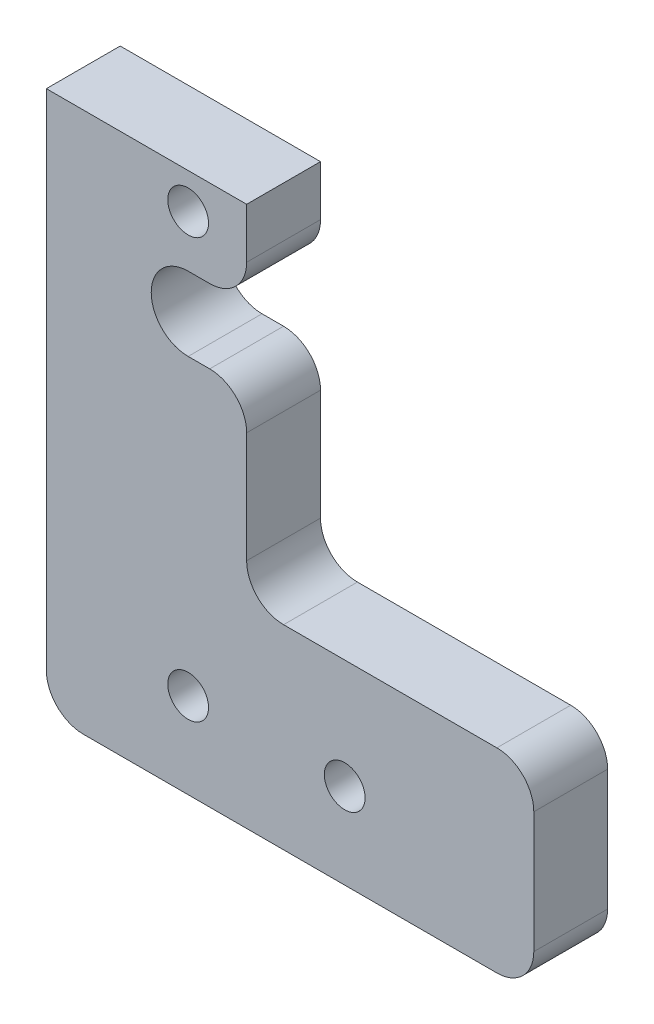
ISO-10303-21;
HEADER;
FILE_DESCRIPTION(('STEP AP214'),'2;1');
FILE_NAME('part.step','',(''),(''),'','','');
FILE_SCHEMA(('AUTOMOTIVE_DESIGN { 1 0 10303 214 1 1 1 1 }'));
ENDSEC;
DATA;
#1=APPLICATION_CONTEXT('core data for automotive mechanical design processes');
#2=APPLICATION_PROTOCOL_DEFINITION('international standard','automotive_design',2000,#1);
#3=PRODUCT_CONTEXT('',#1,'mechanical');
#4=PRODUCT('Part','Part','',(#3));
#5=PRODUCT_RELATED_PRODUCT_CATEGORY('part','',(#4));
#6=PRODUCT_DEFINITION_FORMATION('','',#4);
#7=PRODUCT_DEFINITION_CONTEXT('part definition',#1,'design');
#8=PRODUCT_DEFINITION('design','',#6,#7);
#9=PRODUCT_DEFINITION_SHAPE('','',#8);
#10=(LENGTH_UNIT() NAMED_UNIT(*) SI_UNIT(.MILLI.,.METRE.));
#11=(NAMED_UNIT(*) PLANE_ANGLE_UNIT() SI_UNIT($,.RADIAN.));
#12=(NAMED_UNIT(*) SI_UNIT($,.STERADIAN.) SOLID_ANGLE_UNIT());
#13=UNCERTAINTY_MEASURE_WITH_UNIT(LENGTH_MEASURE(1.E-05),#10,'distance_accuracy_value','');
#14=(GEOMETRIC_REPRESENTATION_CONTEXT(3) GLOBAL_UNCERTAINTY_ASSIGNED_CONTEXT((#13)) GLOBAL_UNIT_ASSIGNED_CONTEXT((#10,
#11,#12)) REPRESENTATION_CONTEXT('',''));
#15=CARTESIAN_POINT('',(0.,0.,0.));
#16=DIRECTION('',(0.,0.,1.));
#17=DIRECTION('',(1.,0.,0.));
#18=AXIS2_PLACEMENT_3D('',#15,#16,#17);
#19=CARTESIAN_POINT('',(0.,3.17500000000002,3.175));
#20=DIRECTION('',(-1.,0.,0.));
#21=DIRECTION('',(0.,-1.,0.));
#22=AXIS2_PLACEMENT_3D('',#19,#20,#21);
#23=PLANE('',#22);
#24=DIRECTION('',(0.,1.,0.));
#25=VECTOR('',#24,1.);
#26=CARTESIAN_POINT('',(0.,3.17500000000002,3.175));
#27=LINE('',#26,#25);
#28=CARTESIAN_POINT('',(0.,25.4,3.175));
#29=VERTEX_POINT('',#28);
#30=CARTESIAN_POINT('',(0.,29.718,3.175));
#31=VERTEX_POINT('',#30);
#32=EDGE_CURVE('E268',#29,#31,#27,.T.);
#33=ORIENTED_EDGE('',*,*,#32,.F.);
#34=DIRECTION('',(0.,0.,-1.));
#35=VECTOR('',#34,1.);
#36=CARTESIAN_POINT('',(0.,25.4,3.175));
#37=LINE('',#36,#35);
#38=CARTESIAN_POINT('',(0.,25.4,-3.175));
#39=VERTEX_POINT('',#38);
#40=EDGE_CURVE('E341',#29,#39,#37,.T.);
#41=ORIENTED_EDGE('',*,*,#40,.T.);
#42=DIRECTION('',(0.,1.,0.));
#43=VECTOR('',#42,1.);
#44=CARTESIAN_POINT('',(0.,3.17500000000002,-3.175));
#45=LINE('',#44,#43);
#46=CARTESIAN_POINT('',(0.,29.718,-3.175));
#47=VERTEX_POINT('',#46);
#48=EDGE_CURVE('E300',#39,#47,#45,.T.);
#49=ORIENTED_EDGE('',*,*,#48,.T.);
#50=DIRECTION('',(0.,0.,-1.));
#51=VECTOR('',#50,1.);
#52=CARTESIAN_POINT('',(0.,29.718,3.175));
#53=LINE('',#52,#51);
#54=EDGE_CURVE('E272',#31,#47,#53,.T.);
#55=ORIENTED_EDGE('',*,*,#54,.F.);
#56=EDGE_LOOP('',(#33,#41,#49,#55));
#57=FACE_BOUND('',#56,.T.);
#58=ADVANCED_FACE('F40',(#57),#23,.F.);
#59=CARTESIAN_POINT('',(-14.0462,-13.589,3.175));
#60=DIRECTION('',(0.,0.,-1.));
#61=DIRECTION('',(-1.,0.,0.));
#62=AXIS2_PLACEMENT_3D('',#59,#60,#61);
#63=PLANE('',#62);
#64=DIRECTION('',(-1.,0.,0.));
#65=VECTOR('',#64,1.);
#66=CARTESIAN_POINT('',(-5.0292,22.225,3.175));
#67=LINE('',#66,#65);
#68=CARTESIAN_POINT('',(-3.175,22.225,3.175));
#69=VERTEX_POINT('',#68);
#70=CARTESIAN_POINT('',(-5.0292,22.225,3.175));
#71=VERTEX_POINT('',#70);
#72=EDGE_CURVE('E204',#69,#71,#67,.T.);
#73=ORIENTED_EDGE('',*,*,#72,.F.);
#74=CARTESIAN_POINT('',(-3.175,25.4,3.175));
#75=DIRECTION('',(0.,0.,-1.));
#76=DIRECTION('',(-1.,0.,0.));
#77=AXIS2_PLACEMENT_3D('',#74,#75,#76);
#78=CIRCLE('',#77,3.175);
#79=EDGE_CURVE('E355',#69,#29,#78,.F.);
#80=ORIENTED_EDGE('',*,*,#79,.T.);
#81=ORIENTED_EDGE('',*,*,#32,.T.);
#82=DIRECTION('',(-1.,0.,0.));
#83=VECTOR('',#82,1.);
#84=CARTESIAN_POINT('',(0.,29.718,3.175));
#85=LINE('',#84,#83);
#86=CARTESIAN_POINT('',(-17.2212,29.718,3.175));
#87=VERTEX_POINT('',#86);
#88=EDGE_CURVE('E241',#31,#87,#85,.T.);
#89=ORIENTED_EDGE('',*,*,#88,.T.);
#90=DIRECTION('',(0.,-1.,0.));
#91=VECTOR('',#90,1.);
#92=CARTESIAN_POINT('',(-17.2212,29.718,3.175));
#93=LINE('',#92,#91);
#94=CARTESIAN_POINT('',(-17.2212,-13.589,3.175));
#95=VERTEX_POINT('',#94);
#96=EDGE_CURVE('E245',#87,#95,#93,.T.);
#97=ORIENTED_EDGE('',*,*,#96,.T.);
#98=CARTESIAN_POINT('',(-14.0462,-13.589,3.175));
#99=DIRECTION('',(0.,0.,1.));
#100=DIRECTION('',(-1.,0.,0.));
#101=AXIS2_PLACEMENT_3D('',#98,#99,#100);
#102=CIRCLE('',#101,3.175);
#103=CARTESIAN_POINT('',(-14.0462,-16.764,3.175));
#104=VERTEX_POINT('',#103);
#105=EDGE_CURVE('E248',#95,#104,#102,.T.);
#106=ORIENTED_EDGE('',*,*,#105,.T.);
#107=DIRECTION('',(1.,0.,0.));
#108=VECTOR('',#107,1.);
#109=CARTESIAN_POINT('',(-14.0462,-16.764,3.175));
#110=LINE('',#109,#108);
#111=CARTESIAN_POINT('',(21.5138,-16.764,3.175));
#112=VERTEX_POINT('',#111);
#113=EDGE_CURVE('E251',#104,#112,#110,.T.);
#114=ORIENTED_EDGE('',*,*,#113,.T.);
#115=CARTESIAN_POINT('',(21.5138,-13.589,3.175));
#116=DIRECTION('',(0.,0.,1.));
#117=DIRECTION('',(-1.,0.,0.));
#118=AXIS2_PLACEMENT_3D('',#115,#116,#117);
#119=CIRCLE('',#118,3.175);
#120=CARTESIAN_POINT('',(24.6888,-13.589,3.175));
#121=VERTEX_POINT('',#120);
#122=EDGE_CURVE('E254',#112,#121,#119,.T.);
#123=ORIENTED_EDGE('',*,*,#122,.T.);
#124=DIRECTION('',(0.,1.,0.));
#125=VECTOR('',#124,1.);
#126=CARTESIAN_POINT('',(24.6888,-13.589,3.175));
#127=LINE('',#126,#125);
#128=CARTESIAN_POINT('',(24.6888,-3.175,3.175));
#129=VERTEX_POINT('',#128);
#130=EDGE_CURVE('E257',#121,#129,#127,.T.);
#131=ORIENTED_EDGE('',*,*,#130,.T.);
#132=CARTESIAN_POINT('',(21.5138,-3.175,3.175));
#133=DIRECTION('',(0.,0.,1.));
#134=DIRECTION('',(1.,0.,0.));
#135=AXIS2_PLACEMENT_3D('',#132,#133,#134);
#136=CIRCLE('',#135,3.175);
#137=CARTESIAN_POINT('',(21.5138,0.,3.175));
#138=VERTEX_POINT('',#137);
#139=EDGE_CURVE('E259',#129,#138,#136,.T.);
#140=ORIENTED_EDGE('',*,*,#139,.T.);
#141=DIRECTION('',(-1.,0.,0.));
#142=VECTOR('',#141,1.);
#143=CARTESIAN_POINT('',(21.5138,0.,3.175));
#144=LINE('',#143,#142);
#145=CARTESIAN_POINT('',(3.17500000000002,0.,3.175));
#146=VERTEX_POINT('',#145);
#147=EDGE_CURVE('E262',#138,#146,#144,.T.);
#148=ORIENTED_EDGE('',*,*,#147,.T.);
#149=CARTESIAN_POINT('',(3.175,3.175,3.175));
#150=DIRECTION('',(0.,0.,-1.));
#151=DIRECTION('',(1.,0.,0.));
#152=AXIS2_PLACEMENT_3D('',#149,#150,#151);
#153=CIRCLE('',#152,3.175);
#154=CARTESIAN_POINT('',(0.,3.17500000000002,3.175));
#155=VERTEX_POINT('',#154);
#156=EDGE_CURVE('E265',#146,#155,#153,.T.);
#157=ORIENTED_EDGE('',*,*,#156,.T.);
#158=CARTESIAN_POINT('',(0.,12.7,3.175));
#159=VERTEX_POINT('',#158);
#160=EDGE_CURVE('E269',#155,#159,#27,.T.);
#161=ORIENTED_EDGE('',*,*,#160,.T.);
#162=CARTESIAN_POINT('',(-3.175,12.7,3.175));
#163=DIRECTION('',(0.,0.,-1.));
#164=DIRECTION('',(-1.,0.,0.));
#165=AXIS2_PLACEMENT_3D('',#162,#163,#164);
#166=CIRCLE('',#165,3.175);
#167=CARTESIAN_POINT('',(-3.175,15.875,3.175));
#168=VERTEX_POINT('',#167);
#169=EDGE_CURVE('E59',#159,#168,#166,.F.);
#170=ORIENTED_EDGE('',*,*,#169,.T.);
#171=DIRECTION('',(1.,0.,0.));
#172=VECTOR('',#171,1.);
#173=CARTESIAN_POINT('',(24.6888,15.875,3.175));
#174=LINE('',#173,#172);
#175=CARTESIAN_POINT('',(-5.0292,15.875,3.175));
#176=VERTEX_POINT('',#175);
#177=EDGE_CURVE('E208',#176,#168,#174,.T.);
#178=ORIENTED_EDGE('',*,*,#177,.F.);
#179=CARTESIAN_POINT('',(-5.0292,19.05,3.175));
#180=DIRECTION('',(0.,0.,1.));
#181=DIRECTION('',(-1.,0.,0.));
#182=AXIS2_PLACEMENT_3D('',#179,#180,#181);
#183=CIRCLE('',#182,3.175);
#184=EDGE_CURVE('E185',#71,#176,#183,.T.);
#185=ORIENTED_EDGE('',*,*,#184,.F.);
#186=EDGE_LOOP('',(#73,#80,#81,#89,#97,#106,#114,#123,#131,#140,#148,#157,#161,#170,#178,#185));
#187=FACE_BOUND('',#186,.T.);
#188=CARTESIAN_POINT('',(-5.0292,26.67,3.175));
#189=DIRECTION('',(0.,0.,1.));
#190=DIRECTION('',(1.,0.,0.));
#191=AXIS2_PLACEMENT_3D('',#188,#189,#190);
#192=CIRCLE('',#191,1.7526);
#193=CARTESIAN_POINT('',(-3.2766,26.67,3.175));
#194=VERTEX_POINT('',#193);
#195=EDGE_CURVE('E233',#194,#194,#192,.T.);
#196=ORIENTED_EDGE('',*,*,#195,.F.);
#197=EDGE_LOOP('',(#196));
#198=FACE_BOUND('',#197,.T.);
#199=CARTESIAN_POINT('',(-5.02920000000001,-9.39799999999999,3.175));
#200=DIRECTION('',(0.,0.,1.));
#201=DIRECTION('',(1.,0.,0.));
#202=AXIS2_PLACEMENT_3D('',#199,#200,#201);
#203=CIRCLE('',#202,1.7526);
#204=CARTESIAN_POINT('',(-3.27660000000001,-9.39799999999999,3.175));
#205=VERTEX_POINT('',#204);
#206=EDGE_CURVE('E225',#205,#205,#203,.T.);
#207=ORIENTED_EDGE('',*,*,#206,.F.);
#208=EDGE_LOOP('',(#207));
#209=FACE_BOUND('',#208,.T.);
#210=CARTESIAN_POINT('',(8.43279999999999,-9.39799999999999,3.175));
#211=DIRECTION('',(0.,0.,1.));
#212=DIRECTION('',(1.,0.,0.));
#213=AXIS2_PLACEMENT_3D('',#210,#211,#212);
#214=CIRCLE('',#213,1.7526);
#215=CARTESIAN_POINT('',(10.1854,-9.39799999999999,3.175));
#216=VERTEX_POINT('',#215);
#217=EDGE_CURVE('E217',#216,#216,#214,.T.);
#218=ORIENTED_EDGE('',*,*,#217,.F.);
#219=EDGE_LOOP('',(#218));
#220=FACE_BOUND('',#219,.T.);
#221=ADVANCED_FACE('F363',(#187,#198,#209,#220),#63,.F.);
#222=CARTESIAN_POINT('',(-14.0462,-13.589,-3.175));
#223=DIRECTION('',(0.,0.,-1.));
#224=DIRECTION('',(-1.,0.,0.));
#225=AXIS2_PLACEMENT_3D('',#222,#223,#224);
#226=PLANE('',#225);
#227=ORIENTED_EDGE('',*,*,#48,.F.);
#228=CARTESIAN_POINT('',(-3.175,25.4,-3.175));
#229=DIRECTION('',(0.,0.,-1.));
#230=DIRECTION('',(-1.,0.,0.));
#231=AXIS2_PLACEMENT_3D('',#228,#229,#230);
#232=CIRCLE('',#231,3.175);
#233=CARTESIAN_POINT('',(-3.175,22.225,-3.175));
#234=VERTEX_POINT('',#233);
#235=EDGE_CURVE('E348',#39,#234,#232,.T.);
#236=ORIENTED_EDGE('',*,*,#235,.T.);
#237=DIRECTION('',(-1.,0.,0.));
#238=VECTOR('',#237,1.);
#239=CARTESIAN_POINT('',(-5.0292,22.225,-3.175));
#240=LINE('',#239,#238);
#241=CARTESIAN_POINT('',(-5.0292,22.225,-3.175));
#242=VERTEX_POINT('',#241);
#243=EDGE_CURVE('E189',#234,#242,#240,.T.);
#244=ORIENTED_EDGE('',*,*,#243,.T.);
#245=CARTESIAN_POINT('',(-5.0292,19.05,-3.175));
#246=DIRECTION('',(0.,0.,1.));
#247=DIRECTION('',(-1.,0.,0.));
#248=AXIS2_PLACEMENT_3D('',#245,#246,#247);
#249=CIRCLE('',#248,3.175);
#250=CARTESIAN_POINT('',(-5.0292,15.875,-3.175));
#251=VERTEX_POINT('',#250);
#252=EDGE_CURVE('E183',#242,#251,#249,.T.);
#253=ORIENTED_EDGE('',*,*,#252,.T.);
#254=DIRECTION('',(1.,0.,0.));
#255=VECTOR('',#254,1.);
#256=CARTESIAN_POINT('',(24.6888,15.875,-3.175));
#257=LINE('',#256,#255);
#258=CARTESIAN_POINT('',(-3.175,15.875,-3.175));
#259=VERTEX_POINT('',#258);
#260=EDGE_CURVE('E192',#251,#259,#257,.T.);
#261=ORIENTED_EDGE('',*,*,#260,.T.);
#262=CARTESIAN_POINT('',(-3.175,12.7,-3.175));
#263=DIRECTION('',(0.,0.,-1.));
#264=DIRECTION('',(-1.,0.,0.));
#265=AXIS2_PLACEMENT_3D('',#262,#263,#264);
#266=CIRCLE('',#265,3.175);
#267=CARTESIAN_POINT('',(0.,12.7,-3.175));
#268=VERTEX_POINT('',#267);
#269=EDGE_CURVE('E345',#259,#268,#266,.T.);
#270=ORIENTED_EDGE('',*,*,#269,.T.);
#271=CARTESIAN_POINT('',(0.,3.17500000000002,-3.175));
#272=VERTEX_POINT('',#271);
#273=EDGE_CURVE('E246',#272,#268,#45,.T.);
#274=ORIENTED_EDGE('',*,*,#273,.F.);
#275=CARTESIAN_POINT('',(3.175,3.175,-3.175));
#276=DIRECTION('',(0.,0.,-1.));
#277=DIRECTION('',(1.,0.,0.));
#278=AXIS2_PLACEMENT_3D('',#275,#276,#277);
#279=CIRCLE('',#278,3.175);
#280=CARTESIAN_POINT('',(3.17500000000002,0.,-3.175));
#281=VERTEX_POINT('',#280);
#282=EDGE_CURVE('E297',#281,#272,#279,.T.);
#283=ORIENTED_EDGE('',*,*,#282,.F.);
#284=DIRECTION('',(-1.,0.,0.));
#285=VECTOR('',#284,1.);
#286=CARTESIAN_POINT('',(21.5138,0.,-3.175));
#287=LINE('',#286,#285);
#288=CARTESIAN_POINT('',(21.5138,0.,-3.175));
#289=VERTEX_POINT('',#288);
#290=EDGE_CURVE('E294',#289,#281,#287,.T.);
#291=ORIENTED_EDGE('',*,*,#290,.F.);
#292=CARTESIAN_POINT('',(21.5138,-3.175,-3.175));
#293=DIRECTION('',(0.,0.,1.));
#294=DIRECTION('',(1.,0.,0.));
#295=AXIS2_PLACEMENT_3D('',#292,#293,#294);
#296=CIRCLE('',#295,3.175);
#297=CARTESIAN_POINT('',(24.6888,-3.175,-3.175));
#298=VERTEX_POINT('',#297);
#299=EDGE_CURVE('E291',#298,#289,#296,.T.);
#300=ORIENTED_EDGE('',*,*,#299,.F.);
#301=DIRECTION('',(0.,1.,0.));
#302=VECTOR('',#301,1.);
#303=CARTESIAN_POINT('',(24.6888,-13.589,-3.175));
#304=LINE('',#303,#302);
#305=CARTESIAN_POINT('',(24.6888,-13.589,-3.175));
#306=VERTEX_POINT('',#305);
#307=EDGE_CURVE('E288',#306,#298,#304,.T.);
#308=ORIENTED_EDGE('',*,*,#307,.F.);
#309=CARTESIAN_POINT('',(21.5138,-13.589,-3.175));
#310=DIRECTION('',(0.,0.,1.));
#311=DIRECTION('',(-1.,0.,0.));
#312=AXIS2_PLACEMENT_3D('',#309,#310,#311);
#313=CIRCLE('',#312,3.175);
#314=CARTESIAN_POINT('',(21.5138,-16.764,-3.175));
#315=VERTEX_POINT('',#314);
#316=EDGE_CURVE('E285',#315,#306,#313,.T.);
#317=ORIENTED_EDGE('',*,*,#316,.F.);
#318=DIRECTION('',(1.,0.,0.));
#319=VECTOR('',#318,1.);
#320=CARTESIAN_POINT('',(-14.0462,-16.764,-3.175));
#321=LINE('',#320,#319);
#322=CARTESIAN_POINT('',(-14.0462,-16.764,-3.175));
#323=VERTEX_POINT('',#322);
#324=EDGE_CURVE('E282',#323,#315,#321,.T.);
#325=ORIENTED_EDGE('',*,*,#324,.F.);
#326=CARTESIAN_POINT('',(-14.0462,-13.589,-3.175));
#327=DIRECTION('',(0.,0.,1.));
#328=DIRECTION('',(-1.,0.,0.));
#329=AXIS2_PLACEMENT_3D('',#326,#327,#328);
#330=CIRCLE('',#329,3.175);
#331=CARTESIAN_POINT('',(-17.2212,-13.589,-3.175));
#332=VERTEX_POINT('',#331);
#333=EDGE_CURVE('E279',#332,#323,#330,.T.);
#334=ORIENTED_EDGE('',*,*,#333,.F.);
#335=DIRECTION('',(0.,-1.,0.));
#336=VECTOR('',#335,1.);
#337=CARTESIAN_POINT('',(-17.2212,29.718,-3.175));
#338=LINE('',#337,#336);
#339=CARTESIAN_POINT('',(-17.2212,29.718,-3.175));
#340=VERTEX_POINT('',#339);
#341=EDGE_CURVE('E276',#340,#332,#338,.T.);
#342=ORIENTED_EDGE('',*,*,#341,.F.);
#343=DIRECTION('',(-1.,0.,0.));
#344=VECTOR('',#343,1.);
#345=CARTESIAN_POINT('',(0.,29.718,-3.175));
#346=LINE('',#345,#344);
#347=EDGE_CURVE('E237',#47,#340,#346,.T.);
#348=ORIENTED_EDGE('',*,*,#347,.F.);
#349=EDGE_LOOP('',(#227,#236,#244,#253,#261,#270,#274,#283,#291,#300,#308,#317,#325,#334,#342,#348));
#350=FACE_BOUND('',#349,.T.);
#351=CARTESIAN_POINT('',(-5.02920000000001,-9.39799999999999,-3.175));
#352=DIRECTION('',(0.,0.,1.));
#353=DIRECTION('',(1.,0.,0.));
#354=AXIS2_PLACEMENT_3D('',#351,#352,#353);
#355=CIRCLE('',#354,1.7526);
#356=CARTESIAN_POINT('',(-3.27660000000001,-9.39799999999999,-3.175));
#357=VERTEX_POINT('',#356);
#358=EDGE_CURVE('E221',#357,#357,#355,.T.);
#359=ORIENTED_EDGE('',*,*,#358,.T.);
#360=EDGE_LOOP('',(#359));
#361=FACE_BOUND('',#360,.T.);
#362=CARTESIAN_POINT('',(-5.0292,26.67,-3.175));
#363=DIRECTION('',(0.,0.,1.));
#364=DIRECTION('',(1.,0.,0.));
#365=AXIS2_PLACEMENT_3D('',#362,#363,#364);
#366=CIRCLE('',#365,1.7526);
#367=CARTESIAN_POINT('',(-3.2766,26.67,-3.175));
#368=VERTEX_POINT('',#367);
#369=EDGE_CURVE('E229',#368,#368,#366,.T.);
#370=ORIENTED_EDGE('',*,*,#369,.T.);
#371=EDGE_LOOP('',(#370));
#372=FACE_BOUND('',#371,.T.);
#373=CARTESIAN_POINT('',(8.43279999999999,-9.39799999999999,-3.175));
#374=DIRECTION('',(0.,0.,1.));
#375=DIRECTION('',(1.,0.,0.));
#376=AXIS2_PLACEMENT_3D('',#373,#374,#375);
#377=CIRCLE('',#376,1.7526);
#378=CARTESIAN_POINT('',(10.1854,-9.39799999999999,-3.175));
#379=VERTEX_POINT('',#378);
#380=EDGE_CURVE('E215',#379,#379,#377,.T.);
#381=ORIENTED_EDGE('',*,*,#380,.T.);
#382=EDGE_LOOP('',(#381));
#383=FACE_BOUND('',#382,.T.);
#384=ADVANCED_FACE('F199',(#350,#361,#372,#383),#226,.T.);
#385=CARTESIAN_POINT('',(0.,29.718,3.175));
#386=DIRECTION('',(0.,-1.,0.));
#387=DIRECTION('',(1.,0.,0.));
#388=AXIS2_PLACEMENT_3D('',#385,#386,#387);
#389=PLANE('',#388);
#390=ORIENTED_EDGE('',*,*,#347,.T.);
#391=DIRECTION('',(0.,0.,-1.));
#392=VECTOR('',#391,1.);
#393=CARTESIAN_POINT('',(-17.2212,29.718,3.175));
#394=LINE('',#393,#392);
#395=EDGE_CURVE('E338',#87,#340,#394,.T.);
#396=ORIENTED_EDGE('',*,*,#395,.F.);
#397=ORIENTED_EDGE('',*,*,#88,.F.);
#398=ORIENTED_EDGE('',*,*,#54,.T.);
#399=EDGE_LOOP('',(#390,#396,#397,#398));
#400=FACE_BOUND('',#399,.T.);
#401=ADVANCED_FACE('F428',(#400),#389,.F.);
#402=CARTESIAN_POINT('',(-17.2212,29.718,3.175));
#403=DIRECTION('',(1.,0.,0.));
#404=DIRECTION('',(0.,1.,0.));
#405=AXIS2_PLACEMENT_3D('',#402,#403,#404);
#406=PLANE('',#405);
#407=ORIENTED_EDGE('',*,*,#341,.T.);
#408=DIRECTION('',(0.,0.,-1.));
#409=VECTOR('',#408,1.);
#410=CARTESIAN_POINT('',(-17.2212,-13.589,3.175));
#411=LINE('',#410,#409);
#412=EDGE_CURVE('E334',#95,#332,#411,.T.);
#413=ORIENTED_EDGE('',*,*,#412,.F.);
#414=ORIENTED_EDGE('',*,*,#96,.F.);
#415=ORIENTED_EDGE('',*,*,#395,.T.);
#416=EDGE_LOOP('',(#407,#413,#414,#415));
#417=FACE_BOUND('',#416,.T.);
#418=ADVANCED_FACE('F424',(#417),#406,.F.);
#419=CARTESIAN_POINT('',(-14.0462,-13.589,3.175));
#420=DIRECTION('',(0.,0.,-1.));
#421=DIRECTION('',(-1.,0.,0.));
#422=AXIS2_PLACEMENT_3D('',#419,#420,#421);
#423=CYLINDRICAL_SURFACE('',#422,3.175);
#424=ORIENTED_EDGE('',*,*,#333,.T.);
#425=DIRECTION('',(0.,0.,-1.));
#426=VECTOR('',#425,1.);
#427=CARTESIAN_POINT('',(-14.0462,-16.764,3.175));
#428=LINE('',#427,#426);
#429=EDGE_CURVE('E330',#104,#323,#428,.T.);
#430=ORIENTED_EDGE('',*,*,#429,.F.);
#431=ORIENTED_EDGE('',*,*,#105,.F.);
#432=ORIENTED_EDGE('',*,*,#412,.T.);
#433=EDGE_LOOP('',(#424,#430,#431,#432));
#434=FACE_BOUND('',#433,.T.);
#435=ADVANCED_FACE('F420',(#434),#423,.T.);
#436=CARTESIAN_POINT('',(-14.0462,-16.764,3.175));
#437=DIRECTION('',(0.,1.,0.));
#438=DIRECTION('',(0.,0.,1.));
#439=AXIS2_PLACEMENT_3D('',#436,#437,#438);
#440=PLANE('',#439);
#441=ORIENTED_EDGE('',*,*,#324,.T.);
#442=DIRECTION('',(0.,0.,-1.));
#443=VECTOR('',#442,1.);
#444=CARTESIAN_POINT('',(21.5138,-16.764,3.175));
#445=LINE('',#444,#443);
#446=EDGE_CURVE('E326',#112,#315,#445,.T.);
#447=ORIENTED_EDGE('',*,*,#446,.F.);
#448=ORIENTED_EDGE('',*,*,#113,.F.);
#449=ORIENTED_EDGE('',*,*,#429,.T.);
#450=EDGE_LOOP('',(#441,#447,#448,#449));
#451=FACE_BOUND('',#450,.T.);
#452=ADVANCED_FACE('F416',(#451),#440,.F.);
#453=CARTESIAN_POINT('',(21.5138,-13.589,3.175));
#454=DIRECTION('',(0.,0.,-1.));
#455=DIRECTION('',(-1.,0.,0.));
#456=AXIS2_PLACEMENT_3D('',#453,#454,#455);
#457=CYLINDRICAL_SURFACE('',#456,3.175);
#458=ORIENTED_EDGE('',*,*,#316,.T.);
#459=DIRECTION('',(0.,0.,-1.));
#460=VECTOR('',#459,1.);
#461=CARTESIAN_POINT('',(24.6888,-13.589,3.175));
#462=LINE('',#461,#460);
#463=EDGE_CURVE('E323',#121,#306,#462,.T.);
#464=ORIENTED_EDGE('',*,*,#463,.F.);
#465=ORIENTED_EDGE('',*,*,#122,.F.);
#466=ORIENTED_EDGE('',*,*,#446,.T.);
#467=EDGE_LOOP('',(#458,#464,#465,#466));
#468=FACE_BOUND('',#467,.T.);
#469=ADVANCED_FACE('F412',(#468),#457,.T.);
#470=CARTESIAN_POINT('',(24.6888,-13.589,3.175));
#471=DIRECTION('',(-1.,0.,0.));
#472=DIRECTION('',(0.,-1.,0.));
#473=AXIS2_PLACEMENT_3D('',#470,#471,#472);
#474=PLANE('',#473);
#475=ORIENTED_EDGE('',*,*,#307,.T.);
#476=DIRECTION('',(0.,0.,-1.));
#477=VECTOR('',#476,1.);
#478=CARTESIAN_POINT('',(24.6888,-3.175,3.175));
#479=LINE('',#478,#477);
#480=EDGE_CURVE('E319',#129,#298,#479,.T.);
#481=ORIENTED_EDGE('',*,*,#480,.F.);
#482=ORIENTED_EDGE('',*,*,#130,.F.);
#483=ORIENTED_EDGE('',*,*,#463,.T.);
#484=EDGE_LOOP('',(#475,#481,#482,#483));
#485=FACE_BOUND('',#484,.T.);
#486=ADVANCED_FACE('F408',(#485),#474,.F.);
#487=CARTESIAN_POINT('',(21.5138,-3.175,3.175));
#488=DIRECTION('',(0.,0.,-1.));
#489=DIRECTION('',(-1.,0.,0.));
#490=AXIS2_PLACEMENT_3D('',#487,#488,#489);
#491=CYLINDRICAL_SURFACE('',#490,3.175);
#492=ORIENTED_EDGE('',*,*,#299,.T.);
#493=DIRECTION('',(0.,0.,-1.));
#494=VECTOR('',#493,1.);
#495=CARTESIAN_POINT('',(21.5138,0.,3.175));
#496=LINE('',#495,#494);
#497=EDGE_CURVE('E315',#138,#289,#496,.T.);
#498=ORIENTED_EDGE('',*,*,#497,.F.);
#499=ORIENTED_EDGE('',*,*,#139,.F.);
#500=ORIENTED_EDGE('',*,*,#480,.T.);
#501=EDGE_LOOP('',(#492,#498,#499,#500));
#502=FACE_BOUND('',#501,.T.);
#503=ADVANCED_FACE('F402',(#502),#491,.T.);
#504=CARTESIAN_POINT('',(21.5138,0.,3.175));
#505=DIRECTION('',(0.,-1.,0.));
#506=DIRECTION('',(1.,0.,0.));
#507=AXIS2_PLACEMENT_3D('',#504,#505,#506);
#508=PLANE('',#507);
#509=ORIENTED_EDGE('',*,*,#290,.T.);
#510=DIRECTION('',(0.,0.,-1.));
#511=VECTOR('',#510,1.);
#512=CARTESIAN_POINT('',(3.17500000000002,0.,3.175));
#513=LINE('',#512,#511);
#514=EDGE_CURVE('E311',#146,#281,#513,.T.);
#515=ORIENTED_EDGE('',*,*,#514,.F.);
#516=ORIENTED_EDGE('',*,*,#147,.F.);
#517=ORIENTED_EDGE('',*,*,#497,.T.);
#518=EDGE_LOOP('',(#509,#515,#516,#517));
#519=FACE_BOUND('',#518,.T.);
#520=ADVANCED_FACE('F398',(#519),#508,.F.);
#521=CARTESIAN_POINT('',(3.175,3.175,3.175));
#522=DIRECTION('',(0.,0.,-1.));
#523=DIRECTION('',(-1.,0.,0.));
#524=AXIS2_PLACEMENT_3D('',#521,#522,#523);
#525=CYLINDRICAL_SURFACE('',#524,3.175);
#526=ORIENTED_EDGE('',*,*,#282,.T.);
#527=DIRECTION('',(0.,0.,-1.));
#528=VECTOR('',#527,1.);
#529=CARTESIAN_POINT('',(0.,3.17500000000002,3.175));
#530=LINE('',#529,#528);
#531=EDGE_CURVE('E307',#155,#272,#530,.T.);
#532=ORIENTED_EDGE('',*,*,#531,.F.);
#533=ORIENTED_EDGE('',*,*,#156,.F.);
#534=ORIENTED_EDGE('',*,*,#514,.T.);
#535=EDGE_LOOP('',(#526,#532,#533,#534));
#536=FACE_BOUND('',#535,.T.);
#537=ADVANCED_FACE('F370',(#536),#525,.F.);
#538=ORIENTED_EDGE('',*,*,#273,.T.);
#539=DIRECTION('',(0.,0.,1.));
#540=VECTOR('',#539,1.);
#541=CARTESIAN_POINT('',(0.,12.7,3.175));
#542=LINE('',#541,#540);
#543=EDGE_CURVE('E49',#268,#159,#542,.T.);
#544=ORIENTED_EDGE('',*,*,#543,.T.);
#545=ORIENTED_EDGE('',*,*,#160,.F.);
#546=ORIENTED_EDGE('',*,*,#531,.T.);
#547=EDGE_LOOP('',(#538,#544,#545,#546));
#548=FACE_BOUND('',#547,.T.);
#549=ADVANCED_FACE('F360',(#548),#23,.F.);
#550=CARTESIAN_POINT('',(-5.0292,26.67,3.175));
#551=DIRECTION('',(0.,0.,-1.));
#552=DIRECTION('',(-1.,0.,0.));
#553=AXIS2_PLACEMENT_3D('',#550,#551,#552);
#554=CYLINDRICAL_SURFACE('',#553,1.7526);
#555=ORIENTED_EDGE('',*,*,#195,.T.);
#556=EDGE_LOOP('',(#555));
#557=FACE_BOUND('',#556,.T.);
#558=ORIENTED_EDGE('',*,*,#369,.F.);
#559=EDGE_LOOP('',(#558));
#560=FACE_BOUND('',#559,.T.);
#561=ADVANCED_FACE('F390',(#557,#560),#554,.F.);
#562=CARTESIAN_POINT('',(-5.02920000000001,-9.39799999999999,3.175));
#563=DIRECTION('',(0.,0.,-1.));
#564=DIRECTION('',(-1.,0.,0.));
#565=AXIS2_PLACEMENT_3D('',#562,#563,#564);
#566=CYLINDRICAL_SURFACE('',#565,1.7526);
#567=ORIENTED_EDGE('',*,*,#206,.T.);
#568=EDGE_LOOP('',(#567));
#569=FACE_BOUND('',#568,.T.);
#570=ORIENTED_EDGE('',*,*,#358,.F.);
#571=EDGE_LOOP('',(#570));
#572=FACE_BOUND('',#571,.T.);
#573=ADVANCED_FACE('F395',(#569,#572),#566,.F.);
#574=CARTESIAN_POINT('',(8.43279999999999,-9.39799999999999,3.175));
#575=DIRECTION('',(0.,0.,-1.));
#576=DIRECTION('',(-1.,0.,0.));
#577=AXIS2_PLACEMENT_3D('',#574,#575,#576);
#578=CYLINDRICAL_SURFACE('',#577,1.7526);
#579=ORIENTED_EDGE('',*,*,#217,.T.);
#580=EDGE_LOOP('',(#579));
#581=FACE_BOUND('',#580,.T.);
#582=ORIENTED_EDGE('',*,*,#380,.F.);
#583=EDGE_LOOP('',(#582));
#584=FACE_BOUND('',#583,.T.);
#585=ADVANCED_FACE('F451',(#581,#584),#578,.F.);
#586=CARTESIAN_POINT('',(-5.0292,22.225,-3.175));
#587=DIRECTION('',(0.,1.,0.));
#588=DIRECTION('',(0.,0.,1.));
#589=AXIS2_PLACEMENT_3D('',#586,#587,#588);
#590=PLANE('',#589);
#591=ORIENTED_EDGE('',*,*,#243,.F.);
#592=DIRECTION('',(0.,0.,-1.));
#593=VECTOR('',#592,1.);
#594=CARTESIAN_POINT('',(-3.175,22.225,-3.175));
#595=LINE('',#594,#593);
#596=EDGE_CURVE('E351',#234,#69,#595,.F.);
#597=ORIENTED_EDGE('',*,*,#596,.T.);
#598=ORIENTED_EDGE('',*,*,#72,.T.);
#599=DIRECTION('',(0.,0.,1.));
#600=VECTOR('',#599,1.);
#601=CARTESIAN_POINT('',(-5.0292,22.225,-3.175));
#602=LINE('',#601,#600);
#603=EDGE_CURVE('E188',#242,#71,#602,.T.);
#604=ORIENTED_EDGE('',*,*,#603,.F.);
#605=EDGE_LOOP('',(#591,#597,#598,#604));
#606=FACE_BOUND('',#605,.T.);
#607=ADVANCED_FACE('F449',(#606),#590,.F.);
#608=CARTESIAN_POINT('',(24.6888,15.875,-3.175));
#609=DIRECTION('',(0.,-1.,0.));
#610=DIRECTION('',(1.,0.,0.));
#611=AXIS2_PLACEMENT_3D('',#608,#609,#610);
#612=PLANE('',#611);
#613=ORIENTED_EDGE('',*,*,#177,.T.);
#614=DIRECTION('',(0.,0.,1.));
#615=VECTOR('',#614,1.);
#616=CARTESIAN_POINT('',(-3.175,15.875,-3.175));
#617=LINE('',#616,#615);
#618=EDGE_CURVE('E11',#168,#259,#617,.F.);
#619=ORIENTED_EDGE('',*,*,#618,.T.);
#620=ORIENTED_EDGE('',*,*,#260,.F.);
#621=DIRECTION('',(0.,0.,1.));
#622=VECTOR('',#621,1.);
#623=CARTESIAN_POINT('',(-5.0292,15.875,-3.175));
#624=LINE('',#623,#622);
#625=EDGE_CURVE('E178',#251,#176,#624,.T.);
#626=ORIENTED_EDGE('',*,*,#625,.T.);
#627=EDGE_LOOP('',(#613,#619,#620,#626));
#628=FACE_BOUND('',#627,.T.);
#629=ADVANCED_FACE('F193',(#628),#612,.F.);
#630=CARTESIAN_POINT('',(-5.0292,19.05,-3.175));
#631=DIRECTION('',(0.,0.,1.));
#632=DIRECTION('',(1.,0.,0.));
#633=AXIS2_PLACEMENT_3D('',#630,#631,#632);
#634=CYLINDRICAL_SURFACE('',#633,3.175);
#635=ORIENTED_EDGE('',*,*,#184,.T.);
#636=ORIENTED_EDGE('',*,*,#625,.F.);
#637=ORIENTED_EDGE('',*,*,#252,.F.);
#638=ORIENTED_EDGE('',*,*,#603,.T.);
#639=EDGE_LOOP('',(#635,#636,#637,#638));
#640=FACE_BOUND('',#639,.T.);
#641=ADVANCED_FACE('F180',(#640),#634,.F.);
#642=CARTESIAN_POINT('',(-3.175,25.4,3.175));
#643=DIRECTION('',(0.,0.,-1.));
#644=DIRECTION('',(-1.,0.,0.));
#645=AXIS2_PLACEMENT_3D('',#642,#643,#644);
#646=CYLINDRICAL_SURFACE('',#645,3.175);
#647=ORIENTED_EDGE('',*,*,#79,.F.);
#648=ORIENTED_EDGE('',*,*,#596,.F.);
#649=ORIENTED_EDGE('',*,*,#235,.F.);
#650=ORIENTED_EDGE('',*,*,#40,.F.);
#651=EDGE_LOOP('',(#647,#648,#649,#650));
#652=FACE_BOUND('',#651,.T.);
#653=ADVANCED_FACE('F374',(#652),#646,.T.);
#654=CARTESIAN_POINT('',(-3.175,12.7,3.175));
#655=DIRECTION('',(0.,0.,1.));
#656=DIRECTION('',(1.,0.,0.));
#657=AXIS2_PLACEMENT_3D('',#654,#655,#656);
#658=CYLINDRICAL_SURFACE('',#657,3.175);
#659=ORIENTED_EDGE('',*,*,#269,.F.);
#660=ORIENTED_EDGE('',*,*,#618,.F.);
#661=ORIENTED_EDGE('',*,*,#169,.F.);
#662=ORIENTED_EDGE('',*,*,#543,.F.);
#663=EDGE_LOOP('',(#659,#660,#661,#662));
#664=FACE_BOUND('',#663,.T.);
#665=ADVANCED_FACE('F42',(#664),#658,.T.);
#666=CLOSED_SHELL('',(#58,#221,#384,#401,#418,#435,#452,#469,#486,#503,#520,#537,#549,#561,#573,
#585,#607,#629,#641,#653,#665));
#667=MANIFOLD_SOLID_BREP('B2',#666);
#668=ADVANCED_BREP_SHAPE_REPRESENTATION('',(#18,#667),#14);
#669=SHAPE_DEFINITION_REPRESENTATION(#9,#668);
ENDSEC;
END-ISO-10303-21;
